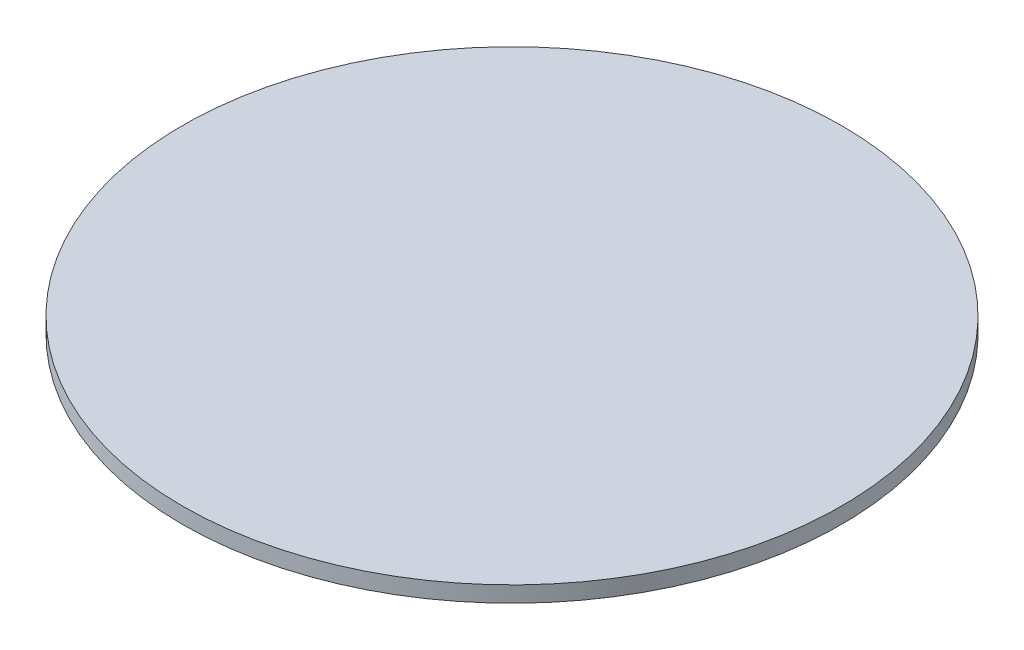
ISO-10303-21;
HEADER;
FILE_DESCRIPTION(('STEP AP214'),'2;1');
FILE_NAME('part.step','',(''),(''),'','','');
FILE_SCHEMA(('AUTOMOTIVE_DESIGN { 1 0 10303 214 1 1 1 1 }'));
ENDSEC;
DATA;
#1=APPLICATION_CONTEXT('core data for automotive mechanical design processes');
#2=APPLICATION_PROTOCOL_DEFINITION('international standard','automotive_design',2000,#1);
#3=PRODUCT_CONTEXT('',#1,'mechanical');
#4=PRODUCT('Part','Part','',(#3));
#5=PRODUCT_RELATED_PRODUCT_CATEGORY('part','',(#4));
#6=PRODUCT_DEFINITION_FORMATION('','',#4);
#7=PRODUCT_DEFINITION_CONTEXT('part definition',#1,'design');
#8=PRODUCT_DEFINITION('design','',#6,#7);
#9=PRODUCT_DEFINITION_SHAPE('','',#8);
#10=(LENGTH_UNIT() NAMED_UNIT(*) SI_UNIT(.MILLI.,.METRE.));
#11=(NAMED_UNIT(*) PLANE_ANGLE_UNIT() SI_UNIT($,.RADIAN.));
#12=(NAMED_UNIT(*) SI_UNIT($,.STERADIAN.) SOLID_ANGLE_UNIT());
#13=UNCERTAINTY_MEASURE_WITH_UNIT(LENGTH_MEASURE(1.E-05),#10,'distance_accuracy_value','');
#14=(GEOMETRIC_REPRESENTATION_CONTEXT(3) GLOBAL_UNCERTAINTY_ASSIGNED_CONTEXT((#13)) GLOBAL_UNIT_ASSIGNED_CONTEXT((#10,
#11,#12)) REPRESENTATION_CONTEXT('',''));
#15=CARTESIAN_POINT('',(0.,0.,0.));
#16=DIRECTION('',(0.,0.,1.));
#17=DIRECTION('',(1.,0.,0.));
#18=AXIS2_PLACEMENT_3D('',#15,#16,#17);
#19=CARTESIAN_POINT('',(0.,3.,0.));
#20=DIRECTION('',(0.,-1.,0.));
#21=DIRECTION('',(0.,0.,-1.));
#22=AXIS2_PLACEMENT_3D('',#19,#20,#21);
#23=CYLINDRICAL_SURFACE('',#22,62.09);
#24=CARTESIAN_POINT('',(0.,3.,0.));
#25=DIRECTION('',(0.,1.,0.));
#26=DIRECTION('',(0.,0.,1.));
#27=AXIS2_PLACEMENT_3D('',#24,#25,#26);
#28=CIRCLE('',#27,62.09);
#29=CARTESIAN_POINT('',(0.,3.,62.09));
#30=VERTEX_POINT('',#29);
#31=EDGE_CURVE('E10',#30,#30,#28,.T.);
#32=ORIENTED_EDGE('',*,*,#31,.F.);
#33=EDGE_LOOP('',(#32));
#34=FACE_BOUND('',#33,.T.);
#35=CARTESIAN_POINT('',(0.,0.,0.));
#36=DIRECTION('',(0.,1.,0.));
#37=DIRECTION('',(0.,0.,1.));
#38=AXIS2_PLACEMENT_3D('',#35,#36,#37);
#39=CIRCLE('',#38,62.09);
#40=CARTESIAN_POINT('',(0.,0.,62.09));
#41=VERTEX_POINT('',#40);
#42=EDGE_CURVE('E40',#41,#41,#39,.T.);
#43=ORIENTED_EDGE('',*,*,#42,.T.);
#44=EDGE_LOOP('',(#43));
#45=FACE_BOUND('',#44,.T.);
#46=ADVANCED_FACE('F37',(#34,#45),#23,.T.);
#47=CARTESIAN_POINT('',(0.,3.,0.));
#48=DIRECTION('',(0.,1.,0.));
#49=DIRECTION('',(0.,0.,1.));
#50=AXIS2_PLACEMENT_3D('',#47,#48,#49);
#51=PLANE('',#50);
#52=ORIENTED_EDGE('',*,*,#31,.T.);
#53=EDGE_LOOP('',(#52));
#54=FACE_BOUND('',#53,.T.);
#55=ADVANCED_FACE('F54',(#54),#51,.T.);
#56=CARTESIAN_POINT('',(0.,0.,0.));
#57=DIRECTION('',(0.,1.,0.));
#58=DIRECTION('',(0.,0.,1.));
#59=AXIS2_PLACEMENT_3D('',#56,#57,#58);
#60=PLANE('',#59);
#61=ORIENTED_EDGE('',*,*,#42,.F.);
#62=EDGE_LOOP('',(#61));
#63=FACE_BOUND('',#62,.T.);
#64=ADVANCED_FACE('F52',(#63),#60,.F.);
#65=CLOSED_SHELL('',(#46,#55,#64));
#66=MANIFOLD_SOLID_BREP('B2',#65);
#67=ADVANCED_BREP_SHAPE_REPRESENTATION('',(#18,#66),#14);
#68=SHAPE_DEFINITION_REPRESENTATION(#9,#67);
ENDSEC;
END-ISO-10303-21;
